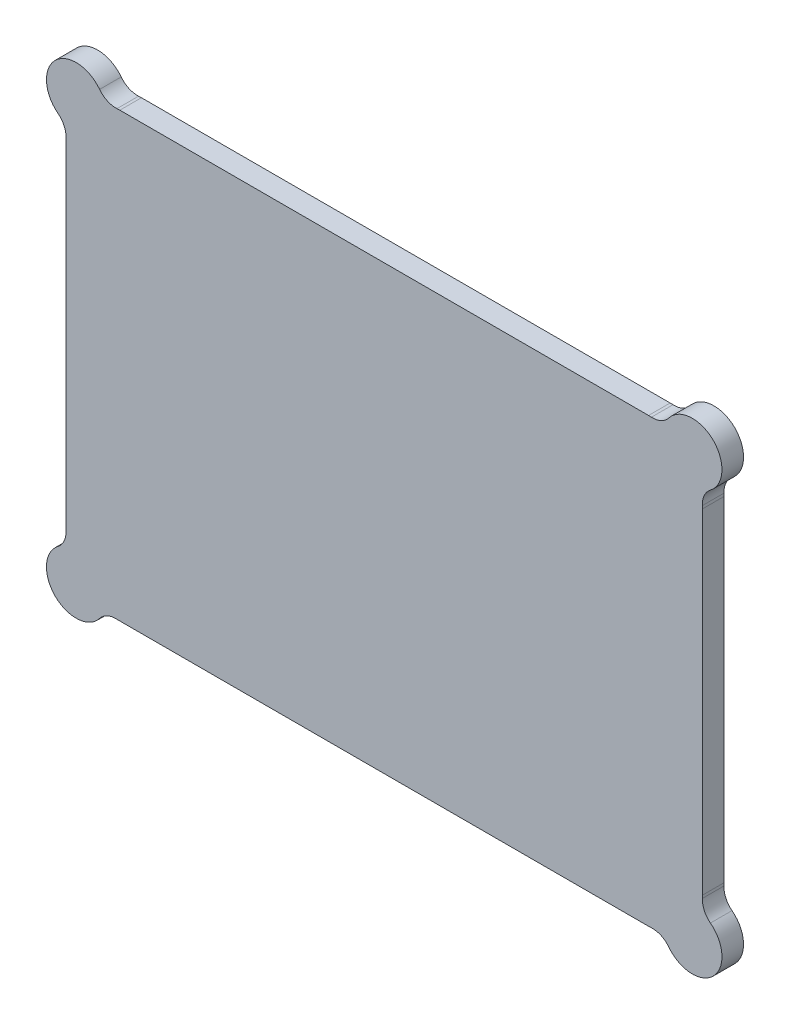
ISO-10303-21;
HEADER;
FILE_DESCRIPTION(('STEP AP214'),'2;1');
FILE_NAME('part.step','',(''),(''),'','','');
FILE_SCHEMA(('AUTOMOTIVE_DESIGN { 1 0 10303 214 1 1 1 1 }'));
ENDSEC;
DATA;
#1=APPLICATION_CONTEXT('core data for automotive mechanical design processes');
#2=APPLICATION_PROTOCOL_DEFINITION('international standard','automotive_design',2000,#1);
#3=PRODUCT_CONTEXT('',#1,'mechanical');
#4=PRODUCT('Part','Part','',(#3));
#5=PRODUCT_RELATED_PRODUCT_CATEGORY('part','',(#4));
#6=PRODUCT_DEFINITION_FORMATION('','',#4);
#7=PRODUCT_DEFINITION_CONTEXT('part definition',#1,'design');
#8=PRODUCT_DEFINITION('design','',#6,#7);
#9=PRODUCT_DEFINITION_SHAPE('','',#8);
#10=(LENGTH_UNIT() NAMED_UNIT(*) SI_UNIT(.MILLI.,.METRE.));
#11=(NAMED_UNIT(*) PLANE_ANGLE_UNIT() SI_UNIT($,.RADIAN.));
#12=(NAMED_UNIT(*) SI_UNIT($,.STERADIAN.) SOLID_ANGLE_UNIT());
#13=UNCERTAINTY_MEASURE_WITH_UNIT(LENGTH_MEASURE(1.E-05),#10,'distance_accuracy_value','');
#14=(GEOMETRIC_REPRESENTATION_CONTEXT(3) GLOBAL_UNCERTAINTY_ASSIGNED_CONTEXT((#13)) GLOBAL_UNIT_ASSIGNED_CONTEXT((#10,
#11,#12)) REPRESENTATION_CONTEXT('',''));
#15=CARTESIAN_POINT('',(0.,0.,0.));
#16=DIRECTION('',(0.,0.,1.));
#17=DIRECTION('',(1.,0.,0.));
#18=AXIS2_PLACEMENT_3D('',#15,#16,#17);
#19=CARTESIAN_POINT('',(-49.0000000000001,31.0000000000001,4.));
#20=DIRECTION('',(0.,0.,-1.));
#21=DIRECTION('',(-1.,0.,0.));
#22=AXIS2_PLACEMENT_3D('',#19,#20,#21);
#23=CYLINDRICAL_SURFACE('',#22,10.);
#24=CARTESIAN_POINT('',(-49.0000000000001,31.0000000000001,0.));
#25=DIRECTION('',(0.,0.,1.));
#26=DIRECTION('',(1.,0.,0.));
#27=AXIS2_PLACEMENT_3D('',#24,#25,#26);
#28=CIRCLE('',#27,10.);
#29=CARTESIAN_POINT('',(-58.9859015098236,31.5308210961377,0.));
#30=VERTEX_POINT('',#29);
#31=CARTESIAN_POINT('',(-59.0000000000001,31.0000000000001,0.));
#32=VERTEX_POINT('',#31);
#33=EDGE_CURVE('E233',#30,#32,#28,.T.);
#34=ORIENTED_EDGE('',*,*,#33,.T.);
#35=DIRECTION('',(0.,0.,-1.));
#36=VECTOR('',#35,1.);
#37=CARTESIAN_POINT('',(-59.0000000000001,31.0000000000001,4.));
#38=LINE('',#37,#36);
#39=CARTESIAN_POINT('',(-59.0000000000001,31.0000000000001,4.));
#40=VERTEX_POINT('',#39);
#41=EDGE_CURVE('E11',#40,#32,#38,.T.);
#42=ORIENTED_EDGE('',*,*,#41,.F.);
#43=CARTESIAN_POINT('',(-49.0000000000001,31.0000000000001,4.));
#44=DIRECTION('',(0.,0.,1.));
#45=DIRECTION('',(1.,0.,0.));
#46=AXIS2_PLACEMENT_3D('',#43,#44,#45);
#47=CIRCLE('',#46,10.);
#48=CARTESIAN_POINT('',(-58.9859015098236,31.5308210961377,4.));
#49=VERTEX_POINT('',#48);
#50=EDGE_CURVE('E294',#49,#40,#47,.T.);
#51=ORIENTED_EDGE('',*,*,#50,.F.);
#52=DIRECTION('',(0.,0.,-1.));
#53=VECTOR('',#52,1.);
#54=CARTESIAN_POINT('',(-58.9859015098236,31.5308210961377,4.));
#55=LINE('',#54,#53);
#56=EDGE_CURVE('E55',#49,#30,#55,.T.);
#57=ORIENTED_EDGE('',*,*,#56,.T.);
#58=EDGE_LOOP('',(#34,#42,#51,#57));
#59=FACE_BOUND('',#58,.T.);
#60=ADVANCED_FACE('F39',(#59),#23,.T.);
#61=CARTESIAN_POINT('',(-59.0000000000001,31.0000000000001,4.));
#62=DIRECTION('',(1.,0.,0.));
#63=DIRECTION('',(0.,0.,-1.));
#64=AXIS2_PLACEMENT_3D('',#61,#62,#63);
#65=PLANE('',#64);
#66=DIRECTION('',(0.,-1.,0.));
#67=VECTOR('',#66,1.);
#68=CARTESIAN_POINT('',(-59.0000000000001,31.0000000000001,0.));
#69=LINE('',#68,#67);
#70=CARTESIAN_POINT('',(-59.0000000000001,-30.9999999999999,0.));
#71=VERTEX_POINT('',#70);
#72=EDGE_CURVE('E235',#32,#71,#69,.T.);
#73=ORIENTED_EDGE('',*,*,#72,.T.);
#74=DIRECTION('',(0.,0.,-1.));
#75=VECTOR('',#74,1.);
#76=CARTESIAN_POINT('',(-59.0000000000001,-30.9999999999999,4.));
#77=LINE('',#76,#75);
#78=CARTESIAN_POINT('',(-59.0000000000001,-30.9999999999999,4.));
#79=VERTEX_POINT('',#78);
#80=EDGE_CURVE('E47',#79,#71,#77,.T.);
#81=ORIENTED_EDGE('',*,*,#80,.F.);
#82=DIRECTION('',(0.,-1.,0.));
#83=VECTOR('',#82,1.);
#84=CARTESIAN_POINT('',(-59.0000000000001,31.0000000000001,4.));
#85=LINE('',#84,#83);
#86=EDGE_CURVE('E142',#40,#79,#85,.T.);
#87=ORIENTED_EDGE('',*,*,#86,.F.);
#88=ORIENTED_EDGE('',*,*,#41,.T.);
#89=EDGE_LOOP('',(#73,#81,#87,#88));
#90=FACE_BOUND('',#89,.T.);
#91=ADVANCED_FACE('F416',(#90),#65,.F.);
#92=CARTESIAN_POINT('',(-49.0000000000001,-30.9999999999999,4.));
#93=DIRECTION('',(0.,0.,-1.));
#94=DIRECTION('',(-1.,0.,0.));
#95=AXIS2_PLACEMENT_3D('',#92,#93,#94);
#96=CYLINDRICAL_SURFACE('',#95,10.);
#97=CARTESIAN_POINT('',(-49.0000000000001,-30.9999999999999,0.));
#98=DIRECTION('',(0.,0.,1.));
#99=DIRECTION('',(1.,0.,0.));
#100=AXIS2_PLACEMENT_3D('',#97,#98,#99);
#101=CIRCLE('',#100,10.);
#102=CARTESIAN_POINT('',(-58.9859015098236,-31.5308210961375,0.));
#103=VERTEX_POINT('',#102);
#104=EDGE_CURVE('E237',#71,#103,#101,.T.);
#105=ORIENTED_EDGE('',*,*,#104,.T.);
#106=DIRECTION('',(0.,0.,-1.));
#107=VECTOR('',#106,1.);
#108=CARTESIAN_POINT('',(-58.9859015098236,-31.5308210961375,4.));
#109=LINE('',#108,#107);
#110=CARTESIAN_POINT('',(-58.9859015098236,-31.5308210961375,4.));
#111=VERTEX_POINT('',#110);
#112=EDGE_CURVE('E338',#111,#103,#109,.T.);
#113=ORIENTED_EDGE('',*,*,#112,.F.);
#114=CARTESIAN_POINT('',(-49.0000000000001,-30.9999999999999,4.));
#115=DIRECTION('',(0.,0.,1.));
#116=DIRECTION('',(1.,0.,0.));
#117=AXIS2_PLACEMENT_3D('',#114,#115,#116);
#118=CIRCLE('',#117,10.);
#119=EDGE_CURVE('E345',#79,#111,#118,.T.);
#120=ORIENTED_EDGE('',*,*,#119,.F.);
#121=ORIENTED_EDGE('',*,*,#80,.T.);
#122=EDGE_LOOP('',(#105,#113,#120,#121));
#123=FACE_BOUND('',#122,.T.);
#124=ADVANCED_FACE('F343',(#123),#96,.T.);
#125=CARTESIAN_POINT('',(-62.7905299850664,-31.7330639337659,4.));
#126=DIRECTION('',(0.,0.,-1.));
#127=DIRECTION('',(-1.,0.,0.));
#128=AXIS2_PLACEMENT_3D('',#125,#126,#127);
#129=CYLINDRICAL_SURFACE('',#128,3.81);
#130=CARTESIAN_POINT('',(-62.7905299850664,-31.7330639337659,0.));
#131=DIRECTION('',(0.,0.,1.));
#132=DIRECTION('',(1.,0.,0.));
#133=AXIS2_PLACEMENT_3D('',#130,#131,#132);
#134=CIRCLE('',#133,3.81);
#135=CARTESIAN_POINT('',(-60.4644540776237,-34.7505912116566,0.));
#136=VERTEX_POINT('',#135);
#137=EDGE_CURVE('E240',#136,#103,#134,.T.);
#138=ORIENTED_EDGE('',*,*,#137,.F.);
#139=DIRECTION('',(0.,0.,-1.));
#140=VECTOR('',#139,1.);
#141=CARTESIAN_POINT('',(-60.4644540776237,-34.7505912116566,4.));
#142=LINE('',#141,#140);
#143=CARTESIAN_POINT('',(-60.4644540776237,-34.7505912116566,4.));
#144=VERTEX_POINT('',#143);
#145=EDGE_CURVE('E336',#144,#136,#142,.T.);
#146=ORIENTED_EDGE('',*,*,#145,.F.);
#147=CARTESIAN_POINT('',(-62.7905299850664,-31.7330639337659,4.));
#148=DIRECTION('',(0.,0.,1.));
#149=DIRECTION('',(1.,0.,0.));
#150=AXIS2_PLACEMENT_3D('',#147,#148,#149);
#151=CIRCLE('',#150,3.81);
#152=EDGE_CURVE('E355',#144,#111,#151,.T.);
#153=ORIENTED_EDGE('',*,*,#152,.T.);
#154=ORIENTED_EDGE('',*,*,#112,.T.);
#155=EDGE_LOOP('',(#138,#146,#153,#154));
#156=FACE_BOUND('',#155,.T.);
#157=ADVANCED_FACE('F351',(#156),#129,.F.);
#158=CARTESIAN_POINT('',(-57.1066017177983,-39.1066017177981,4.));
#159=DIRECTION('',(0.,0.,-1.));
#160=DIRECTION('',(-1.,0.,0.));
#161=AXIS2_PLACEMENT_3D('',#158,#159,#160);
#162=CYLINDRICAL_SURFACE('',#161,5.49999999999999);
#163=CARTESIAN_POINT('',(-57.1066017177983,-39.1066017177981,0.));
#164=DIRECTION('',(0.,0.,1.));
#165=DIRECTION('',(1.,0.,0.));
#166=AXIS2_PLACEMENT_3D('',#163,#164,#165);
#167=CIRCLE('',#166,5.49999999999999);
#168=CARTESIAN_POINT('',(-52.7505912116568,-42.4644540776235,0.));
#169=VERTEX_POINT('',#168);
#170=EDGE_CURVE('E243',#136,#169,#167,.T.);
#171=ORIENTED_EDGE('',*,*,#170,.T.);
#172=DIRECTION('',(0.,0.,-1.));
#173=VECTOR('',#172,1.);
#174=CARTESIAN_POINT('',(-52.7505912116568,-42.4644540776235,4.));
#175=LINE('',#174,#173);
#176=CARTESIAN_POINT('',(-52.7505912116568,-42.4644540776235,4.));
#177=VERTEX_POINT('',#176);
#178=EDGE_CURVE('E334',#177,#169,#175,.T.);
#179=ORIENTED_EDGE('',*,*,#178,.F.);
#180=CARTESIAN_POINT('',(-57.1066017177983,-39.1066017177981,4.));
#181=DIRECTION('',(0.,0.,1.));
#182=DIRECTION('',(1.,0.,0.));
#183=AXIS2_PLACEMENT_3D('',#180,#181,#182);
#184=CIRCLE('',#183,5.49999999999999);
#185=EDGE_CURVE('E356',#144,#177,#184,.T.);
#186=ORIENTED_EDGE('',*,*,#185,.F.);
#187=ORIENTED_EDGE('',*,*,#145,.T.);
#188=EDGE_LOOP('',(#171,#179,#186,#187));
#189=FACE_BOUND('',#188,.T.);
#190=ADVANCED_FACE('F429',(#189),#162,.T.);
#191=CARTESIAN_POINT('',(-49.7330639337661,-44.7905299850661,4.));
#192=DIRECTION('',(0.,0.,-1.));
#193=DIRECTION('',(-1.,0.,0.));
#194=AXIS2_PLACEMENT_3D('',#191,#192,#193);
#195=CYLINDRICAL_SURFACE('',#194,3.81);
#196=CARTESIAN_POINT('',(-49.7330639337661,-44.7905299850661,0.));
#197=DIRECTION('',(0.,0.,1.));
#198=DIRECTION('',(1.,0.,0.));
#199=AXIS2_PLACEMENT_3D('',#196,#197,#198);
#200=CIRCLE('',#199,3.81);
#201=CARTESIAN_POINT('',(-49.5308210961377,-40.9859015098234,0.));
#202=VERTEX_POINT('',#201);
#203=EDGE_CURVE('E246',#202,#169,#200,.T.);
#204=ORIENTED_EDGE('',*,*,#203,.F.);
#205=DIRECTION('',(0.,0.,-1.));
#206=VECTOR('',#205,1.);
#207=CARTESIAN_POINT('',(-49.5308210961377,-40.9859015098234,4.));
#208=LINE('',#207,#206);
#209=CARTESIAN_POINT('',(-49.5308210961377,-40.9859015098234,4.));
#210=VERTEX_POINT('',#209);
#211=EDGE_CURVE('E332',#210,#202,#208,.T.);
#212=ORIENTED_EDGE('',*,*,#211,.F.);
#213=CARTESIAN_POINT('',(-49.7330639337661,-44.7905299850661,4.));
#214=DIRECTION('',(0.,0.,1.));
#215=DIRECTION('',(1.,0.,0.));
#216=AXIS2_PLACEMENT_3D('',#213,#214,#215);
#217=CIRCLE('',#216,3.81);
#218=EDGE_CURVE('E358',#210,#177,#217,.T.);
#219=ORIENTED_EDGE('',*,*,#218,.T.);
#220=ORIENTED_EDGE('',*,*,#178,.T.);
#221=EDGE_LOOP('',(#204,#212,#219,#220));
#222=FACE_BOUND('',#221,.T.);
#223=ADVANCED_FACE('F432',(#222),#195,.F.);
#224=CARTESIAN_POINT('',(-49.0000000000001,-30.9999999999999,4.));
#225=DIRECTION('',(0.,0.,-1.));
#226=DIRECTION('',(-1.,0.,0.));
#227=AXIS2_PLACEMENT_3D('',#224,#225,#226);
#228=CYLINDRICAL_SURFACE('',#227,10.);
#229=CARTESIAN_POINT('',(-49.0000000000001,-30.9999999999999,0.));
#230=DIRECTION('',(0.,0.,1.));
#231=DIRECTION('',(1.,0.,0.));
#232=AXIS2_PLACEMENT_3D('',#229,#230,#231);
#233=CIRCLE('',#232,10.);
#234=CARTESIAN_POINT('',(-49.0000000000001,-40.9999999999999,0.));
#235=VERTEX_POINT('',#234);
#236=EDGE_CURVE('E249',#202,#235,#233,.T.);
#237=ORIENTED_EDGE('',*,*,#236,.T.);
#238=DIRECTION('',(0.,0.,-1.));
#239=VECTOR('',#238,1.);
#240=CARTESIAN_POINT('',(-49.0000000000001,-40.9999999999999,4.));
#241=LINE('',#240,#239);
#242=CARTESIAN_POINT('',(-49.0000000000001,-40.9999999999999,4.));
#243=VERTEX_POINT('',#242);
#244=EDGE_CURVE('E329',#243,#235,#241,.T.);
#245=ORIENTED_EDGE('',*,*,#244,.F.);
#246=CARTESIAN_POINT('',(-49.0000000000001,-30.9999999999999,4.));
#247=DIRECTION('',(0.,0.,1.));
#248=DIRECTION('',(1.,0.,0.));
#249=AXIS2_PLACEMENT_3D('',#246,#247,#248);
#250=CIRCLE('',#249,10.);
#251=EDGE_CURVE('E365',#210,#243,#250,.T.);
#252=ORIENTED_EDGE('',*,*,#251,.F.);
#253=ORIENTED_EDGE('',*,*,#211,.T.);
#254=EDGE_LOOP('',(#237,#245,#252,#253));
#255=FACE_BOUND('',#254,.T.);
#256=ADVANCED_FACE('F436',(#255),#228,.T.);
#257=CARTESIAN_POINT('',(-49.0000000000001,-40.9999999999999,4.));
#258=DIRECTION('',(0.,1.,0.));
#259=DIRECTION('',(0.,0.,1.));
#260=AXIS2_PLACEMENT_3D('',#257,#258,#259);
#261=PLANE('',#260);
#262=DIRECTION('',(1.,0.,0.));
#263=VECTOR('',#262,1.);
#264=CARTESIAN_POINT('',(-49.0000000000001,-40.9999999999999,0.));
#265=LINE('',#264,#263);
#266=CARTESIAN_POINT('',(48.9999999999999,-40.9999999999999,0.));
#267=VERTEX_POINT('',#266);
#268=EDGE_CURVE('E251',#235,#267,#265,.T.);
#269=ORIENTED_EDGE('',*,*,#268,.T.);
#270=DIRECTION('',(0.,0.,-1.));
#271=VECTOR('',#270,1.);
#272=CARTESIAN_POINT('',(48.9999999999999,-40.9999999999999,4.));
#273=LINE('',#272,#271);
#274=CARTESIAN_POINT('',(48.9999999999999,-40.9999999999999,4.));
#275=VERTEX_POINT('',#274);
#276=EDGE_CURVE('E326',#275,#267,#273,.T.);
#277=ORIENTED_EDGE('',*,*,#276,.F.);
#278=DIRECTION('',(1.,0.,0.));
#279=VECTOR('',#278,1.);
#280=CARTESIAN_POINT('',(-49.0000000000001,-40.9999999999999,4.));
#281=LINE('',#280,#279);
#282=EDGE_CURVE('E367',#243,#275,#281,.T.);
#283=ORIENTED_EDGE('',*,*,#282,.F.);
#284=ORIENTED_EDGE('',*,*,#244,.T.);
#285=EDGE_LOOP('',(#269,#277,#283,#284));
#286=FACE_BOUND('',#285,.T.);
#287=ADVANCED_FACE('F440',(#286),#261,.F.);
#288=CARTESIAN_POINT('',(48.9999999999999,-30.9999999999999,4.));
#289=DIRECTION('',(0.,0.,-1.));
#290=DIRECTION('',(-1.,0.,0.));
#291=AXIS2_PLACEMENT_3D('',#288,#289,#290);
#292=CYLINDRICAL_SURFACE('',#291,10.);
#293=CARTESIAN_POINT('',(48.9999999999999,-30.9999999999999,0.));
#294=DIRECTION('',(0.,0.,1.));
#295=DIRECTION('',(1.,0.,0.));
#296=AXIS2_PLACEMENT_3D('',#293,#294,#295);
#297=CIRCLE('',#296,10.);
#298=CARTESIAN_POINT('',(49.5308210961375,-40.9859015098234,0.));
#299=VERTEX_POINT('',#298);
#300=EDGE_CURVE('E253',#267,#299,#297,.T.);
#301=ORIENTED_EDGE('',*,*,#300,.T.);
#302=DIRECTION('',(0.,0.,-1.));
#303=VECTOR('',#302,1.);
#304=CARTESIAN_POINT('',(49.5308210961375,-40.9859015098234,4.));
#305=LINE('',#304,#303);
#306=CARTESIAN_POINT('',(49.5308210961375,-40.9859015098234,4.));
#307=VERTEX_POINT('',#306);
#308=EDGE_CURVE('E324',#307,#299,#305,.T.);
#309=ORIENTED_EDGE('',*,*,#308,.F.);
#310=CARTESIAN_POINT('',(48.9999999999999,-30.9999999999999,4.));
#311=DIRECTION('',(0.,0.,1.));
#312=DIRECTION('',(1.,0.,0.));
#313=AXIS2_PLACEMENT_3D('',#310,#311,#312);
#314=CIRCLE('',#313,10.);
#315=EDGE_CURVE('E369',#275,#307,#314,.T.);
#316=ORIENTED_EDGE('',*,*,#315,.F.);
#317=ORIENTED_EDGE('',*,*,#276,.T.);
#318=EDGE_LOOP('',(#301,#309,#316,#317));
#319=FACE_BOUND('',#318,.T.);
#320=ADVANCED_FACE('F444',(#319),#292,.T.);
#321=CARTESIAN_POINT('',(49.7330639337659,-44.7905299850662,4.));
#322=DIRECTION('',(0.,0.,-1.));
#323=DIRECTION('',(-1.,0.,0.));
#324=AXIS2_PLACEMENT_3D('',#321,#322,#323);
#325=CYLINDRICAL_SURFACE('',#324,3.81);
#326=CARTESIAN_POINT('',(49.7330639337659,-44.7905299850662,0.));
#327=DIRECTION('',(0.,0.,1.));
#328=DIRECTION('',(1.,0.,0.));
#329=AXIS2_PLACEMENT_3D('',#326,#327,#328);
#330=CIRCLE('',#329,3.81);
#331=CARTESIAN_POINT('',(52.7505912116566,-42.4644540776235,0.));
#332=VERTEX_POINT('',#331);
#333=EDGE_CURVE('E256',#332,#299,#330,.T.);
#334=ORIENTED_EDGE('',*,*,#333,.F.);
#335=DIRECTION('',(0.,0.,-1.));
#336=VECTOR('',#335,1.);
#337=CARTESIAN_POINT('',(52.7505912116566,-42.4644540776235,4.));
#338=LINE('',#337,#336);
#339=CARTESIAN_POINT('',(52.7505912116566,-42.4644540776235,4.));
#340=VERTEX_POINT('',#339);
#341=EDGE_CURVE('E322',#340,#332,#338,.T.);
#342=ORIENTED_EDGE('',*,*,#341,.F.);
#343=CARTESIAN_POINT('',(49.7330639337659,-44.7905299850662,4.));
#344=DIRECTION('',(0.,0.,1.));
#345=DIRECTION('',(1.,0.,0.));
#346=AXIS2_PLACEMENT_3D('',#343,#344,#345);
#347=CIRCLE('',#346,3.81);
#348=EDGE_CURVE('E371',#340,#307,#347,.T.);
#349=ORIENTED_EDGE('',*,*,#348,.T.);
#350=ORIENTED_EDGE('',*,*,#308,.T.);
#351=EDGE_LOOP('',(#334,#342,#349,#350));
#352=FACE_BOUND('',#351,.T.);
#353=ADVANCED_FACE('F448',(#352),#325,.F.);
#354=CARTESIAN_POINT('',(57.1066017177981,-39.1066017177981,4.));
#355=DIRECTION('',(0.,0.,-1.));
#356=DIRECTION('',(-1.,0.,0.));
#357=AXIS2_PLACEMENT_3D('',#354,#355,#356);
#358=CYLINDRICAL_SURFACE('',#357,5.49999999999999);
#359=CARTESIAN_POINT('',(57.1066017177981,-39.1066017177981,0.));
#360=DIRECTION('',(0.,0.,1.));
#361=DIRECTION('',(1.,0.,0.));
#362=AXIS2_PLACEMENT_3D('',#359,#360,#361);
#363=CIRCLE('',#362,5.49999999999999);
#364=CARTESIAN_POINT('',(60.4644540776235,-34.7505912116566,0.));
#365=VERTEX_POINT('',#364);
#366=EDGE_CURVE('E259',#332,#365,#363,.T.);
#367=ORIENTED_EDGE('',*,*,#366,.T.);
#368=DIRECTION('',(0.,0.,-1.));
#369=VECTOR('',#368,1.);
#370=CARTESIAN_POINT('',(60.4644540776235,-34.7505912116566,4.));
#371=LINE('',#370,#369);
#372=CARTESIAN_POINT('',(60.4644540776235,-34.7505912116566,4.));
#373=VERTEX_POINT('',#372);
#374=EDGE_CURVE('E320',#373,#365,#371,.T.);
#375=ORIENTED_EDGE('',*,*,#374,.F.);
#376=CARTESIAN_POINT('',(57.1066017177981,-39.1066017177981,4.));
#377=DIRECTION('',(0.,0.,1.));
#378=DIRECTION('',(1.,0.,0.));
#379=AXIS2_PLACEMENT_3D('',#376,#377,#378);
#380=CIRCLE('',#379,5.49999999999999);
#381=EDGE_CURVE('E374',#340,#373,#380,.T.);
#382=ORIENTED_EDGE('',*,*,#381,.F.);
#383=ORIENTED_EDGE('',*,*,#341,.T.);
#384=EDGE_LOOP('',(#367,#375,#382,#383));
#385=FACE_BOUND('',#384,.T.);
#386=ADVANCED_FACE('F452',(#385),#358,.T.);
#387=CARTESIAN_POINT('',(62.7905299850662,-31.7330639337658,4.));
#388=DIRECTION('',(0.,0.,-1.));
#389=DIRECTION('',(-1.,0.,0.));
#390=AXIS2_PLACEMENT_3D('',#387,#388,#389);
#391=CYLINDRICAL_SURFACE('',#390,3.81000000000001);
#392=CARTESIAN_POINT('',(62.7905299850662,-31.7330639337658,0.));
#393=DIRECTION('',(0.,0.,1.));
#394=DIRECTION('',(1.,0.,0.));
#395=AXIS2_PLACEMENT_3D('',#392,#393,#394);
#396=CIRCLE('',#395,3.81000000000001);
#397=CARTESIAN_POINT('',(58.9859015098234,-31.5308210961374,0.));
#398=VERTEX_POINT('',#397);
#399=EDGE_CURVE('E262',#398,#365,#396,.T.);
#400=ORIENTED_EDGE('',*,*,#399,.F.);
#401=DIRECTION('',(0.,0.,-1.));
#402=VECTOR('',#401,1.);
#403=CARTESIAN_POINT('',(58.9859015098234,-31.5308210961374,4.));
#404=LINE('',#403,#402);
#405=CARTESIAN_POINT('',(58.9859015098234,-31.5308210961374,4.));
#406=VERTEX_POINT('',#405);
#407=EDGE_CURVE('E318',#406,#398,#404,.T.);
#408=ORIENTED_EDGE('',*,*,#407,.F.);
#409=CARTESIAN_POINT('',(62.7905299850662,-31.7330639337658,4.));
#410=DIRECTION('',(0.,0.,1.));
#411=DIRECTION('',(1.,0.,0.));
#412=AXIS2_PLACEMENT_3D('',#409,#410,#411);
#413=CIRCLE('',#412,3.81000000000001);
#414=EDGE_CURVE('E376',#406,#373,#413,.T.);
#415=ORIENTED_EDGE('',*,*,#414,.T.);
#416=ORIENTED_EDGE('',*,*,#374,.T.);
#417=EDGE_LOOP('',(#400,#408,#415,#416));
#418=FACE_BOUND('',#417,.T.);
#419=ADVANCED_FACE('F456',(#418),#391,.F.);
#420=CARTESIAN_POINT('',(48.9999999999999,-30.9999999999999,4.));
#421=DIRECTION('',(0.,0.,-1.));
#422=DIRECTION('',(-1.,0.,0.));
#423=AXIS2_PLACEMENT_3D('',#420,#421,#422);
#424=CYLINDRICAL_SURFACE('',#423,10.);
#425=CARTESIAN_POINT('',(48.9999999999999,-30.9999999999999,0.));
#426=DIRECTION('',(0.,0.,1.));
#427=DIRECTION('',(1.,0.,0.));
#428=AXIS2_PLACEMENT_3D('',#425,#426,#427);
#429=CIRCLE('',#428,10.);
#430=CARTESIAN_POINT('',(58.9999999999999,-30.9999999999999,0.));
#431=VERTEX_POINT('',#430);
#432=EDGE_CURVE('E265',#398,#431,#429,.T.);
#433=ORIENTED_EDGE('',*,*,#432,.T.);
#434=DIRECTION('',(0.,0.,-1.));
#435=VECTOR('',#434,1.);
#436=CARTESIAN_POINT('',(58.9999999999999,-30.9999999999999,4.));
#437=LINE('',#436,#435);
#438=CARTESIAN_POINT('',(58.9999999999999,-30.9999999999999,4.));
#439=VERTEX_POINT('',#438);
#440=EDGE_CURVE('E315',#439,#431,#437,.T.);
#441=ORIENTED_EDGE('',*,*,#440,.F.);
#442=CARTESIAN_POINT('',(48.9999999999999,-30.9999999999999,4.));
#443=DIRECTION('',(0.,0.,1.));
#444=DIRECTION('',(1.,0.,0.));
#445=AXIS2_PLACEMENT_3D('',#442,#443,#444);
#446=CIRCLE('',#445,10.);
#447=EDGE_CURVE('E379',#406,#439,#446,.T.);
#448=ORIENTED_EDGE('',*,*,#447,.F.);
#449=ORIENTED_EDGE('',*,*,#407,.T.);
#450=EDGE_LOOP('',(#433,#441,#448,#449));
#451=FACE_BOUND('',#450,.T.);
#452=ADVANCED_FACE('F460',(#451),#424,.T.);
#453=CARTESIAN_POINT('',(58.9999999999999,-30.9999999999999,4.));
#454=DIRECTION('',(-1.,0.,0.));
#455=DIRECTION('',(0.,-1.,0.));
#456=AXIS2_PLACEMENT_3D('',#453,#454,#455);
#457=PLANE('',#456);
#458=DIRECTION('',(0.,1.,0.));
#459=VECTOR('',#458,1.);
#460=CARTESIAN_POINT('',(58.9999999999999,-30.9999999999999,0.));
#461=LINE('',#460,#459);
#462=CARTESIAN_POINT('',(58.9999999999999,31.0000000000001,0.));
#463=VERTEX_POINT('',#462);
#464=EDGE_CURVE('E267',#431,#463,#461,.T.);
#465=ORIENTED_EDGE('',*,*,#464,.T.);
#466=DIRECTION('',(0.,0.,-1.));
#467=VECTOR('',#466,1.);
#468=CARTESIAN_POINT('',(58.9999999999999,31.0000000000001,4.));
#469=LINE('',#468,#467);
#470=CARTESIAN_POINT('',(58.9999999999999,31.0000000000001,4.));
#471=VERTEX_POINT('',#470);
#472=EDGE_CURVE('E312',#471,#463,#469,.T.);
#473=ORIENTED_EDGE('',*,*,#472,.F.);
#474=DIRECTION('',(0.,1.,0.));
#475=VECTOR('',#474,1.);
#476=CARTESIAN_POINT('',(58.9999999999999,-30.9999999999999,4.));
#477=LINE('',#476,#475);
#478=EDGE_CURVE('E381',#439,#471,#477,.T.);
#479=ORIENTED_EDGE('',*,*,#478,.F.);
#480=ORIENTED_EDGE('',*,*,#440,.T.);
#481=EDGE_LOOP('',(#465,#473,#479,#480));
#482=FACE_BOUND('',#481,.T.);
#483=ADVANCED_FACE('F464',(#482),#457,.F.);
#484=CARTESIAN_POINT('',(48.9999999999999,31.0000000000001,4.));
#485=DIRECTION('',(0.,0.,-1.));
#486=DIRECTION('',(-1.,0.,0.));
#487=AXIS2_PLACEMENT_3D('',#484,#485,#486);
#488=CYLINDRICAL_SURFACE('',#487,10.);
#489=CARTESIAN_POINT('',(48.9999999999999,31.0000000000001,0.));
#490=DIRECTION('',(0.,0.,1.));
#491=DIRECTION('',(1.,0.,0.));
#492=AXIS2_PLACEMENT_3D('',#489,#490,#491);
#493=CIRCLE('',#492,10.);
#494=CARTESIAN_POINT('',(58.9859015098234,31.5308210961377,0.));
#495=VERTEX_POINT('',#494);
#496=EDGE_CURVE('E269',#463,#495,#493,.T.);
#497=ORIENTED_EDGE('',*,*,#496,.T.);
#498=DIRECTION('',(0.,0.,-1.));
#499=VECTOR('',#498,1.);
#500=CARTESIAN_POINT('',(58.9859015098234,31.5308210961377,4.));
#501=LINE('',#500,#499);
#502=CARTESIAN_POINT('',(58.9859015098234,31.5308210961377,4.));
#503=VERTEX_POINT('',#502);
#504=EDGE_CURVE('E310',#503,#495,#501,.T.);
#505=ORIENTED_EDGE('',*,*,#504,.F.);
#506=CARTESIAN_POINT('',(48.9999999999999,31.0000000000001,4.));
#507=DIRECTION('',(0.,0.,1.));
#508=DIRECTION('',(1.,0.,0.));
#509=AXIS2_PLACEMENT_3D('',#506,#507,#508);
#510=CIRCLE('',#509,10.);
#511=EDGE_CURVE('E383',#471,#503,#510,.T.);
#512=ORIENTED_EDGE('',*,*,#511,.F.);
#513=ORIENTED_EDGE('',*,*,#472,.T.);
#514=EDGE_LOOP('',(#497,#505,#512,#513));
#515=FACE_BOUND('',#514,.T.);
#516=ADVANCED_FACE('F468',(#515),#488,.T.);
#517=CARTESIAN_POINT('',(62.7905299850661,31.7330639337661,4.));
#518=DIRECTION('',(0.,0.,-1.));
#519=DIRECTION('',(-1.,0.,0.));
#520=AXIS2_PLACEMENT_3D('',#517,#518,#519);
#521=CYLINDRICAL_SURFACE('',#520,3.81);
#522=CARTESIAN_POINT('',(62.7905299850661,31.7330639337661,0.));
#523=DIRECTION('',(0.,0.,1.));
#524=DIRECTION('',(1.,0.,0.));
#525=AXIS2_PLACEMENT_3D('',#522,#523,#524);
#526=CIRCLE('',#525,3.81);
#527=CARTESIAN_POINT('',(60.4644540776235,34.7505912116568,0.));
#528=VERTEX_POINT('',#527);
#529=EDGE_CURVE('E272',#528,#495,#526,.T.);
#530=ORIENTED_EDGE('',*,*,#529,.F.);
#531=DIRECTION('',(0.,0.,-1.));
#532=VECTOR('',#531,1.);
#533=CARTESIAN_POINT('',(60.4644540776235,34.7505912116568,4.));
#534=LINE('',#533,#532);
#535=CARTESIAN_POINT('',(60.4644540776235,34.7505912116568,4.));
#536=VERTEX_POINT('',#535);
#537=EDGE_CURVE('E308',#536,#528,#534,.T.);
#538=ORIENTED_EDGE('',*,*,#537,.F.);
#539=CARTESIAN_POINT('',(62.7905299850661,31.7330639337661,4.));
#540=DIRECTION('',(0.,0.,1.));
#541=DIRECTION('',(1.,0.,0.));
#542=AXIS2_PLACEMENT_3D('',#539,#540,#541);
#543=CIRCLE('',#542,3.81);
#544=EDGE_CURVE('E385',#536,#503,#543,.T.);
#545=ORIENTED_EDGE('',*,*,#544,.T.);
#546=ORIENTED_EDGE('',*,*,#504,.T.);
#547=EDGE_LOOP('',(#530,#538,#545,#546));
#548=FACE_BOUND('',#547,.T.);
#549=ADVANCED_FACE('F472',(#548),#521,.F.);
#550=CARTESIAN_POINT('',(57.1066017177981,39.1066017177983,4.));
#551=DIRECTION('',(0.,0.,-1.));
#552=DIRECTION('',(-1.,0.,0.));
#553=AXIS2_PLACEMENT_3D('',#550,#551,#552);
#554=CYLINDRICAL_SURFACE('',#553,5.49999999999999);
#555=CARTESIAN_POINT('',(57.1066017177981,39.1066017177983,0.));
#556=DIRECTION('',(0.,0.,1.));
#557=DIRECTION('',(1.,0.,0.));
#558=AXIS2_PLACEMENT_3D('',#555,#556,#557);
#559=CIRCLE('',#558,5.49999999999999);
#560=CARTESIAN_POINT('',(52.7505912116566,42.4644540776237,0.));
#561=VERTEX_POINT('',#560);
#562=EDGE_CURVE('E275',#528,#561,#559,.T.);
#563=ORIENTED_EDGE('',*,*,#562,.T.);
#564=DIRECTION('',(0.,0.,-1.));
#565=VECTOR('',#564,1.);
#566=CARTESIAN_POINT('',(52.7505912116566,42.4644540776237,4.));
#567=LINE('',#566,#565);
#568=CARTESIAN_POINT('',(52.7505912116566,42.4644540776237,4.));
#569=VERTEX_POINT('',#568);
#570=EDGE_CURVE('E306',#569,#561,#567,.T.);
#571=ORIENTED_EDGE('',*,*,#570,.F.);
#572=CARTESIAN_POINT('',(57.1066017177981,39.1066017177983,4.));
#573=DIRECTION('',(0.,0.,1.));
#574=DIRECTION('',(1.,0.,0.));
#575=AXIS2_PLACEMENT_3D('',#572,#573,#574);
#576=CIRCLE('',#575,5.49999999999999);
#577=EDGE_CURVE('E388',#536,#569,#576,.T.);
#578=ORIENTED_EDGE('',*,*,#577,.F.);
#579=ORIENTED_EDGE('',*,*,#537,.T.);
#580=EDGE_LOOP('',(#563,#571,#578,#579));
#581=FACE_BOUND('',#580,.T.);
#582=ADVANCED_FACE('F476',(#581),#554,.T.);
#583=CARTESIAN_POINT('',(49.7330639337659,44.7905299850663,4.));
#584=DIRECTION('',(0.,0.,-1.));
#585=DIRECTION('',(-1.,0.,0.));
#586=AXIS2_PLACEMENT_3D('',#583,#584,#585);
#587=CYLINDRICAL_SURFACE('',#586,3.81);
#588=CARTESIAN_POINT('',(49.7330639337659,44.7905299850663,0.));
#589=DIRECTION('',(0.,0.,1.));
#590=DIRECTION('',(1.,0.,0.));
#591=AXIS2_PLACEMENT_3D('',#588,#589,#590);
#592=CIRCLE('',#591,3.81);
#593=CARTESIAN_POINT('',(49.5308210961374,40.9859015098236,0.));
#594=VERTEX_POINT('',#593);
#595=EDGE_CURVE('E278',#594,#561,#592,.T.);
#596=ORIENTED_EDGE('',*,*,#595,.F.);
#597=DIRECTION('',(0.,0.,-1.));
#598=VECTOR('',#597,1.);
#599=CARTESIAN_POINT('',(49.5308210961374,40.9859015098236,4.));
#600=LINE('',#599,#598);
#601=CARTESIAN_POINT('',(49.5308210961374,40.9859015098236,4.));
#602=VERTEX_POINT('',#601);
#603=EDGE_CURVE('E304',#602,#594,#600,.T.);
#604=ORIENTED_EDGE('',*,*,#603,.F.);
#605=CARTESIAN_POINT('',(49.7330639337659,44.7905299850663,4.));
#606=DIRECTION('',(0.,0.,1.));
#607=DIRECTION('',(1.,0.,0.));
#608=AXIS2_PLACEMENT_3D('',#605,#606,#607);
#609=CIRCLE('',#608,3.81);
#610=EDGE_CURVE('E390',#602,#569,#609,.T.);
#611=ORIENTED_EDGE('',*,*,#610,.T.);
#612=ORIENTED_EDGE('',*,*,#570,.T.);
#613=EDGE_LOOP('',(#596,#604,#611,#612));
#614=FACE_BOUND('',#613,.T.);
#615=ADVANCED_FACE('F480',(#614),#587,.F.);
#616=CARTESIAN_POINT('',(48.9999999999999,31.0000000000001,4.));
#617=DIRECTION('',(0.,0.,-1.));
#618=DIRECTION('',(-1.,0.,0.));
#619=AXIS2_PLACEMENT_3D('',#616,#617,#618);
#620=CYLINDRICAL_SURFACE('',#619,10.);
#621=CARTESIAN_POINT('',(48.9999999999999,31.0000000000001,0.));
#622=DIRECTION('',(0.,0.,1.));
#623=DIRECTION('',(1.,0.,0.));
#624=AXIS2_PLACEMENT_3D('',#621,#622,#623);
#625=CIRCLE('',#624,10.);
#626=CARTESIAN_POINT('',(48.9999999999999,41.0000000000001,0.));
#627=VERTEX_POINT('',#626);
#628=EDGE_CURVE('E281',#594,#627,#625,.T.);
#629=ORIENTED_EDGE('',*,*,#628,.T.);
#630=DIRECTION('',(0.,0.,-1.));
#631=VECTOR('',#630,1.);
#632=CARTESIAN_POINT('',(48.9999999999999,41.0000000000001,4.));
#633=LINE('',#632,#631);
#634=CARTESIAN_POINT('',(48.9999999999999,41.0000000000001,4.));
#635=VERTEX_POINT('',#634);
#636=EDGE_CURVE('E301',#635,#627,#633,.T.);
#637=ORIENTED_EDGE('',*,*,#636,.F.);
#638=CARTESIAN_POINT('',(48.9999999999999,31.0000000000001,4.));
#639=DIRECTION('',(0.,0.,1.));
#640=DIRECTION('',(1.,0.,0.));
#641=AXIS2_PLACEMENT_3D('',#638,#639,#640);
#642=CIRCLE('',#641,10.);
#643=EDGE_CURVE('E393',#602,#635,#642,.T.);
#644=ORIENTED_EDGE('',*,*,#643,.F.);
#645=ORIENTED_EDGE('',*,*,#603,.T.);
#646=EDGE_LOOP('',(#629,#637,#644,#645));
#647=FACE_BOUND('',#646,.T.);
#648=ADVANCED_FACE('F484',(#647),#620,.T.);
#649=CARTESIAN_POINT('',(48.9999999999999,41.0000000000001,4.));
#650=DIRECTION('',(0.,-1.,0.));
#651=DIRECTION('',(0.,0.,-1.));
#652=AXIS2_PLACEMENT_3D('',#649,#650,#651);
#653=PLANE('',#652);
#654=DIRECTION('',(-1.,0.,0.));
#655=VECTOR('',#654,1.);
#656=CARTESIAN_POINT('',(48.9999999999999,41.0000000000001,0.));
#657=LINE('',#656,#655);
#658=CARTESIAN_POINT('',(-49.0000000000001,41.0000000000001,0.));
#659=VERTEX_POINT('',#658);
#660=EDGE_CURVE('E283',#627,#659,#657,.T.);
#661=ORIENTED_EDGE('',*,*,#660,.T.);
#662=DIRECTION('',(0.,0.,-1.));
#663=VECTOR('',#662,1.);
#664=CARTESIAN_POINT('',(-49.0000000000001,41.0000000000001,4.));
#665=LINE('',#664,#663);
#666=CARTESIAN_POINT('',(-49.0000000000001,41.0000000000001,4.));
#667=VERTEX_POINT('',#666);
#668=EDGE_CURVE('E298',#667,#659,#665,.T.);
#669=ORIENTED_EDGE('',*,*,#668,.F.);
#670=DIRECTION('',(-1.,0.,0.));
#671=VECTOR('',#670,1.);
#672=CARTESIAN_POINT('',(48.9999999999999,41.0000000000001,4.));
#673=LINE('',#672,#671);
#674=EDGE_CURVE('E228',#635,#667,#673,.T.);
#675=ORIENTED_EDGE('',*,*,#674,.F.);
#676=ORIENTED_EDGE('',*,*,#636,.T.);
#677=EDGE_LOOP('',(#661,#669,#675,#676));
#678=FACE_BOUND('',#677,.T.);
#679=ADVANCED_FACE('F400',(#678),#653,.F.);
#680=CARTESIAN_POINT('',(-49.0000000000001,31.0000000000001,4.));
#681=DIRECTION('',(0.,0.,-1.));
#682=DIRECTION('',(-1.,0.,0.));
#683=AXIS2_PLACEMENT_3D('',#680,#681,#682);
#684=CYLINDRICAL_SURFACE('',#683,10.);
#685=CARTESIAN_POINT('',(-49.0000000000001,31.0000000000001,0.));
#686=DIRECTION('',(0.,0.,1.));
#687=DIRECTION('',(1.,0.,0.));
#688=AXIS2_PLACEMENT_3D('',#685,#686,#687);
#689=CIRCLE('',#688,10.);
#690=CARTESIAN_POINT('',(-49.5308210961377,40.9859015098236,0.));
#691=VERTEX_POINT('',#690);
#692=EDGE_CURVE('E285',#659,#691,#689,.T.);
#693=ORIENTED_EDGE('',*,*,#692,.T.);
#694=DIRECTION('',(0.,0.,-1.));
#695=VECTOR('',#694,1.);
#696=CARTESIAN_POINT('',(-49.5308210961377,40.9859015098236,4.));
#697=LINE('',#696,#695);
#698=CARTESIAN_POINT('',(-49.5308210961377,40.9859015098236,4.));
#699=VERTEX_POINT('',#698);
#700=EDGE_CURVE('E215',#699,#691,#697,.T.);
#701=ORIENTED_EDGE('',*,*,#700,.F.);
#702=CARTESIAN_POINT('',(-49.0000000000001,31.0000000000001,4.));
#703=DIRECTION('',(0.,0.,1.));
#704=DIRECTION('',(1.,0.,0.));
#705=AXIS2_PLACEMENT_3D('',#702,#703,#704);
#706=CIRCLE('',#705,10.);
#707=EDGE_CURVE('E225',#667,#699,#706,.T.);
#708=ORIENTED_EDGE('',*,*,#707,.F.);
#709=ORIENTED_EDGE('',*,*,#668,.T.);
#710=EDGE_LOOP('',(#693,#701,#708,#709));
#711=FACE_BOUND('',#710,.T.);
#712=ADVANCED_FACE('F404',(#711),#684,.T.);
#713=CARTESIAN_POINT('',(-49.7330639337661,44.7905299850664,4.));
#714=DIRECTION('',(0.,0.,-1.));
#715=DIRECTION('',(-1.,0.,0.));
#716=AXIS2_PLACEMENT_3D('',#713,#714,#715);
#717=CYLINDRICAL_SURFACE('',#716,3.81);
#718=CARTESIAN_POINT('',(-49.7330639337661,44.7905299850664,0.));
#719=DIRECTION('',(0.,0.,1.));
#720=DIRECTION('',(1.,0.,0.));
#721=AXIS2_PLACEMENT_3D('',#718,#719,#720);
#722=CIRCLE('',#721,3.81);
#723=CARTESIAN_POINT('',(-52.7505912116568,42.4644540776237,0.));
#724=VERTEX_POINT('',#723);
#725=EDGE_CURVE('E212',#724,#691,#722,.T.);
#726=ORIENTED_EDGE('',*,*,#725,.F.);
#727=DIRECTION('',(0.,0.,-1.));
#728=VECTOR('',#727,1.);
#729=CARTESIAN_POINT('',(-52.7505912116568,42.4644540776237,4.));
#730=LINE('',#729,#728);
#731=CARTESIAN_POINT('',(-52.7505912116568,42.4644540776237,4.));
#732=VERTEX_POINT('',#731);
#733=EDGE_CURVE('E206',#732,#724,#730,.T.);
#734=ORIENTED_EDGE('',*,*,#733,.F.);
#735=CARTESIAN_POINT('',(-49.7330639337661,44.7905299850664,4.));
#736=DIRECTION('',(0.,0.,1.));
#737=DIRECTION('',(1.,0.,0.));
#738=AXIS2_PLACEMENT_3D('',#735,#736,#737);
#739=CIRCLE('',#738,3.81);
#740=EDGE_CURVE('E210',#732,#699,#739,.T.);
#741=ORIENTED_EDGE('',*,*,#740,.T.);
#742=ORIENTED_EDGE('',*,*,#700,.T.);
#743=EDGE_LOOP('',(#726,#734,#741,#742));
#744=FACE_BOUND('',#743,.T.);
#745=ADVANCED_FACE('F208',(#744),#717,.F.);
#746=CARTESIAN_POINT('',(-57.1066017177983,39.1066017177983,4.));
#747=DIRECTION('',(0.,0.,-1.));
#748=DIRECTION('',(-1.,0.,0.));
#749=AXIS2_PLACEMENT_3D('',#746,#747,#748);
#750=CYLINDRICAL_SURFACE('',#749,5.49999999999999);
#751=CARTESIAN_POINT('',(-57.1066017177983,39.1066017177983,0.));
#752=DIRECTION('',(0.,0.,1.));
#753=DIRECTION('',(1.,0.,0.));
#754=AXIS2_PLACEMENT_3D('',#751,#752,#753);
#755=CIRCLE('',#754,5.49999999999999);
#756=CARTESIAN_POINT('',(-60.4644540776237,34.7505912116568,0.));
#757=VERTEX_POINT('',#756);
#758=EDGE_CURVE('E289',#724,#757,#755,.T.);
#759=ORIENTED_EDGE('',*,*,#758,.T.);
#760=DIRECTION('',(0.,0.,-1.));
#761=VECTOR('',#760,1.);
#762=CARTESIAN_POINT('',(-60.4644540776237,34.7505912116568,4.));
#763=LINE('',#762,#761);
#764=CARTESIAN_POINT('',(-60.4644540776237,34.7505912116568,4.));
#765=VERTEX_POINT('',#764);
#766=EDGE_CURVE('E130',#765,#757,#763,.T.);
#767=ORIENTED_EDGE('',*,*,#766,.F.);
#768=CARTESIAN_POINT('',(-57.1066017177983,39.1066017177983,4.));
#769=DIRECTION('',(0.,0.,1.));
#770=DIRECTION('',(1.,0.,0.));
#771=AXIS2_PLACEMENT_3D('',#768,#769,#770);
#772=CIRCLE('',#771,5.49999999999999);
#773=EDGE_CURVE('E217',#732,#765,#772,.T.);
#774=ORIENTED_EDGE('',*,*,#773,.F.);
#775=ORIENTED_EDGE('',*,*,#733,.T.);
#776=EDGE_LOOP('',(#759,#767,#774,#775));
#777=FACE_BOUND('',#776,.T.);
#778=ADVANCED_FACE('F218',(#777),#750,.T.);
#779=CARTESIAN_POINT('',(-62.7905299850664,31.7330639337661,4.));
#780=DIRECTION('',(0.,0.,-1.));
#781=DIRECTION('',(-1.,0.,0.));
#782=AXIS2_PLACEMENT_3D('',#779,#780,#781);
#783=CYLINDRICAL_SURFACE('',#782,3.81);
#784=CARTESIAN_POINT('',(-62.7905299850664,31.7330639337661,0.));
#785=DIRECTION('',(0.,0.,1.));
#786=DIRECTION('',(1.,0.,0.));
#787=AXIS2_PLACEMENT_3D('',#784,#785,#786);
#788=CIRCLE('',#787,3.81);
#789=EDGE_CURVE('E291',#30,#757,#788,.T.);
#790=ORIENTED_EDGE('',*,*,#789,.F.);
#791=ORIENTED_EDGE('',*,*,#56,.F.);
#792=CARTESIAN_POINT('',(-62.7905299850664,31.7330639337661,4.));
#793=DIRECTION('',(0.,0.,1.));
#794=DIRECTION('',(1.,0.,0.));
#795=AXIS2_PLACEMENT_3D('',#792,#793,#794);
#796=CIRCLE('',#795,3.81);
#797=EDGE_CURVE('E221',#49,#765,#796,.T.);
#798=ORIENTED_EDGE('',*,*,#797,.T.);
#799=ORIENTED_EDGE('',*,*,#766,.T.);
#800=EDGE_LOOP('',(#790,#791,#798,#799));
#801=FACE_BOUND('',#800,.T.);
#802=ADVANCED_FACE('F405',(#801),#783,.F.);
#803=CARTESIAN_POINT('',(-49.0000000000001,31.0000000000001,4.));
#804=DIRECTION('',(0.,0.,1.));
#805=DIRECTION('',(1.,0.,0.));
#806=AXIS2_PLACEMENT_3D('',#803,#804,#805);
#807=PLANE('',#806);
#808=ORIENTED_EDGE('',*,*,#50,.T.);
#809=ORIENTED_EDGE('',*,*,#86,.T.);
#810=ORIENTED_EDGE('',*,*,#119,.T.);
#811=ORIENTED_EDGE('',*,*,#152,.F.);
#812=ORIENTED_EDGE('',*,*,#185,.T.);
#813=ORIENTED_EDGE('',*,*,#218,.F.);
#814=ORIENTED_EDGE('',*,*,#251,.T.);
#815=ORIENTED_EDGE('',*,*,#282,.T.);
#816=ORIENTED_EDGE('',*,*,#315,.T.);
#817=ORIENTED_EDGE('',*,*,#348,.F.);
#818=ORIENTED_EDGE('',*,*,#381,.T.);
#819=ORIENTED_EDGE('',*,*,#414,.F.);
#820=ORIENTED_EDGE('',*,*,#447,.T.);
#821=ORIENTED_EDGE('',*,*,#478,.T.);
#822=ORIENTED_EDGE('',*,*,#511,.T.);
#823=ORIENTED_EDGE('',*,*,#544,.F.);
#824=ORIENTED_EDGE('',*,*,#577,.T.);
#825=ORIENTED_EDGE('',*,*,#610,.F.);
#826=ORIENTED_EDGE('',*,*,#643,.T.);
#827=ORIENTED_EDGE('',*,*,#674,.T.);
#828=ORIENTED_EDGE('',*,*,#707,.T.);
#829=ORIENTED_EDGE('',*,*,#740,.F.);
#830=ORIENTED_EDGE('',*,*,#773,.T.);
#831=ORIENTED_EDGE('',*,*,#797,.F.);
#832=EDGE_LOOP('',(#808,#809,#810,#811,#812,#813,#814,#815,#816,#817,#818,#819,#820,#821,#822,
#823,#824,#825,#826,#827,#828,#829,#830,#831));
#833=FACE_BOUND('',#832,.T.);
#834=ADVANCED_FACE('F223',(#833),#807,.T.);
#835=CARTESIAN_POINT('',(-49.0000000000001,31.0000000000001,0.));
#836=DIRECTION('',(0.,0.,1.));
#837=DIRECTION('',(1.,0.,0.));
#838=AXIS2_PLACEMENT_3D('',#835,#836,#837);
#839=PLANE('',#838);
#840=ORIENTED_EDGE('',*,*,#33,.F.);
#841=ORIENTED_EDGE('',*,*,#789,.T.);
#842=ORIENTED_EDGE('',*,*,#758,.F.);
#843=ORIENTED_EDGE('',*,*,#725,.T.);
#844=ORIENTED_EDGE('',*,*,#692,.F.);
#845=ORIENTED_EDGE('',*,*,#660,.F.);
#846=ORIENTED_EDGE('',*,*,#628,.F.);
#847=ORIENTED_EDGE('',*,*,#595,.T.);
#848=ORIENTED_EDGE('',*,*,#562,.F.);
#849=ORIENTED_EDGE('',*,*,#529,.T.);
#850=ORIENTED_EDGE('',*,*,#496,.F.);
#851=ORIENTED_EDGE('',*,*,#464,.F.);
#852=ORIENTED_EDGE('',*,*,#432,.F.);
#853=ORIENTED_EDGE('',*,*,#399,.T.);
#854=ORIENTED_EDGE('',*,*,#366,.F.);
#855=ORIENTED_EDGE('',*,*,#333,.T.);
#856=ORIENTED_EDGE('',*,*,#300,.F.);
#857=ORIENTED_EDGE('',*,*,#268,.F.);
#858=ORIENTED_EDGE('',*,*,#236,.F.);
#859=ORIENTED_EDGE('',*,*,#203,.T.);
#860=ORIENTED_EDGE('',*,*,#170,.F.);
#861=ORIENTED_EDGE('',*,*,#137,.T.);
#862=ORIENTED_EDGE('',*,*,#104,.F.);
#863=ORIENTED_EDGE('',*,*,#72,.F.);
#864=EDGE_LOOP('',(#840,#841,#842,#843,#844,#845,#846,#847,#848,#849,#850,#851,#852,#853,#854,
#855,#856,#857,#858,#859,#860,#861,#862,#863));
#865=FACE_BOUND('',#864,.T.);
#866=ADVANCED_FACE('F347',(#865),#839,.F.);
#867=CLOSED_SHELL('',(#60,#91,#124,#157,#190,#223,#256,#287,#320,#353,#386,#419,#452,#483,#516,
#549,#582,#615,#648,#679,#712,#745,#778,#802,#834,#866));
#868=MANIFOLD_SOLID_BREP('B2',#867);
#869=ADVANCED_BREP_SHAPE_REPRESENTATION('',(#18,#868),#14);
#870=SHAPE_DEFINITION_REPRESENTATION(#9,#869);
ENDSEC;
END-ISO-10303-21;
